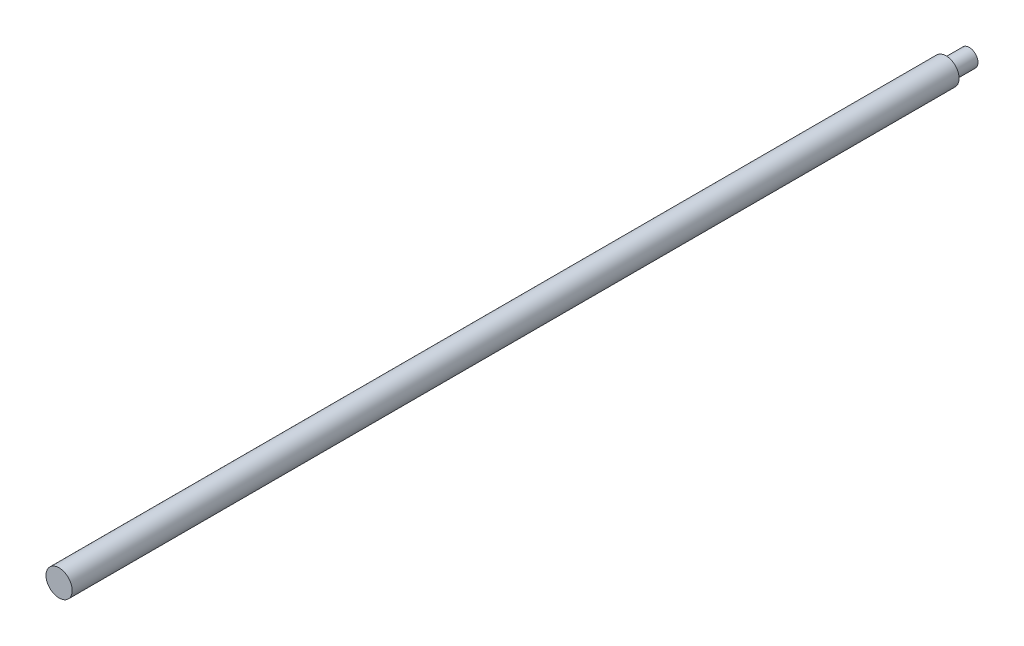
ISO-10303-21;
HEADER;
FILE_DESCRIPTION(('STEP AP214'),'2;1');
FILE_NAME('part.step','',(''),(''),'','','');
FILE_SCHEMA(('AUTOMOTIVE_DESIGN { 1 0 10303 214 1 1 1 1 }'));
ENDSEC;
DATA;
#1=APPLICATION_CONTEXT('core data for automotive mechanical design processes');
#2=APPLICATION_PROTOCOL_DEFINITION('international standard','automotive_design',2000,#1);
#3=PRODUCT_CONTEXT('',#1,'mechanical');
#4=PRODUCT('Part','Part','',(#3));
#5=PRODUCT_RELATED_PRODUCT_CATEGORY('part','',(#4));
#6=PRODUCT_DEFINITION_FORMATION('','',#4);
#7=PRODUCT_DEFINITION_CONTEXT('part definition',#1,'design');
#8=PRODUCT_DEFINITION('design','',#6,#7);
#9=PRODUCT_DEFINITION_SHAPE('','',#8);
#10=(LENGTH_UNIT() NAMED_UNIT(*) SI_UNIT(.MILLI.,.METRE.));
#11=(NAMED_UNIT(*) PLANE_ANGLE_UNIT() SI_UNIT($,.RADIAN.));
#12=(NAMED_UNIT(*) SI_UNIT($,.STERADIAN.) SOLID_ANGLE_UNIT());
#13=UNCERTAINTY_MEASURE_WITH_UNIT(LENGTH_MEASURE(1.E-05),#10,'distance_accuracy_value','');
#14=(GEOMETRIC_REPRESENTATION_CONTEXT(3) GLOBAL_UNCERTAINTY_ASSIGNED_CONTEXT((#13)) GLOBAL_UNIT_ASSIGNED_CONTEXT((#10,
#11,#12)) REPRESENTATION_CONTEXT('',''));
#15=CARTESIAN_POINT('',(0.,0.,0.));
#16=DIRECTION('',(0.,0.,1.));
#17=DIRECTION('',(1.,0.,0.));
#18=AXIS2_PLACEMENT_3D('',#15,#16,#17);
#19=CARTESIAN_POINT('',(0.,0.,-4.));
#20=DIRECTION('',(0.,0.,-1.));
#21=DIRECTION('',(-1.,0.,0.));
#22=AXIS2_PLACEMENT_3D('',#19,#20,#21);
#23=PLANE('',#22);
#24=CARTESIAN_POINT('',(0.,0.,-4.));
#25=DIRECTION('',(0.,0.,1.));
#26=DIRECTION('',(1.,0.,0.));
#27=AXIS2_PLACEMENT_3D('',#24,#25,#26);
#28=CIRCLE('',#27,1.5);
#29=CARTESIAN_POINT('',(1.5,0.,-4.));
#30=VERTEX_POINT('',#29);
#31=EDGE_CURVE('E18',#30,#30,#28,.T.);
#32=ORIENTED_EDGE('',*,*,#31,.F.);
#33=EDGE_LOOP('',(#32));
#34=FACE_BOUND('',#33,.T.);
#35=ADVANCED_FACE('F15',(#34),#23,.T.);
#36=CARTESIAN_POINT('',(0.,0.,-4.));
#37=DIRECTION('',(0.,0.,1.));
#38=DIRECTION('',(1.,0.,0.));
#39=AXIS2_PLACEMENT_3D('',#36,#37,#38);
#40=CYLINDRICAL_SURFACE('',#39,1.5);
#41=ORIENTED_EDGE('',*,*,#31,.T.);
#42=EDGE_LOOP('',(#41));
#43=FACE_BOUND('',#42,.T.);
#44=CARTESIAN_POINT('',(0.,0.,0.));
#45=DIRECTION('',(0.,0.,1.));
#46=DIRECTION('',(1.,0.,0.));
#47=AXIS2_PLACEMENT_3D('',#44,#45,#46);
#48=CIRCLE('',#47,1.5);
#49=CARTESIAN_POINT('',(1.5,0.,0.));
#50=VERTEX_POINT('',#49);
#51=EDGE_CURVE('E27',#50,#50,#48,.F.);
#52=ORIENTED_EDGE('',*,*,#51,.T.);
#53=EDGE_LOOP('',(#52));
#54=FACE_BOUND('',#53,.T.);
#55=ADVANCED_FACE('F35',(#43,#54),#40,.T.);
#56=CARTESIAN_POINT('',(0.,0.,152.4));
#57=DIRECTION('',(0.,0.,1.));
#58=DIRECTION('',(1.,0.,0.));
#59=AXIS2_PLACEMENT_3D('',#56,#57,#58);
#60=PLANE('',#59);
#61=CARTESIAN_POINT('',(0.,0.,152.4));
#62=DIRECTION('',(0.,0.,-1.));
#63=DIRECTION('',(-1.,0.,0.));
#64=AXIS2_PLACEMENT_3D('',#61,#62,#63);
#65=CIRCLE('',#64,2.25);
#66=CARTESIAN_POINT('',(-2.25,0.,152.4));
#67=VERTEX_POINT('',#66);
#68=EDGE_CURVE('E22',#67,#67,#65,.T.);
#69=ORIENTED_EDGE('',*,*,#68,.F.);
#70=EDGE_LOOP('',(#69));
#71=FACE_BOUND('',#70,.T.);
#72=ADVANCED_FACE('F42',(#71),#60,.T.);
#73=CARTESIAN_POINT('',(0.,0.,0.));
#74=DIRECTION('',(0.,0.,1.));
#75=DIRECTION('',(1.,0.,0.));
#76=AXIS2_PLACEMENT_3D('',#73,#74,#75);
#77=PLANE('',#76);
#78=ORIENTED_EDGE('',*,*,#51,.F.);
#79=EDGE_LOOP('',(#78));
#80=FACE_BOUND('',#79,.T.);
#81=CARTESIAN_POINT('',(0.,0.,0.));
#82=DIRECTION('',(0.,0.,-1.));
#83=DIRECTION('',(-1.,0.,0.));
#84=AXIS2_PLACEMENT_3D('',#81,#82,#83);
#85=CIRCLE('',#84,2.25);
#86=CARTESIAN_POINT('',(-2.25,0.,0.));
#87=VERTEX_POINT('',#86);
#88=EDGE_CURVE('E10',#87,#87,#85,.F.);
#89=ORIENTED_EDGE('',*,*,#88,.F.);
#90=EDGE_LOOP('',(#89));
#91=FACE_BOUND('',#90,.T.);
#92=ADVANCED_FACE('F45',(#80,#91),#77,.F.);
#93=CARTESIAN_POINT('',(0.,0.,152.4));
#94=DIRECTION('',(0.,0.,-1.));
#95=DIRECTION('',(-1.,0.,0.));
#96=AXIS2_PLACEMENT_3D('',#93,#94,#95);
#97=CYLINDRICAL_SURFACE('',#96,2.25);
#98=ORIENTED_EDGE('',*,*,#88,.T.);
#99=EDGE_LOOP('',(#98));
#100=FACE_BOUND('',#99,.T.);
#101=ORIENTED_EDGE('',*,*,#68,.T.);
#102=EDGE_LOOP('',(#101));
#103=FACE_BOUND('',#102,.T.);
#104=ADVANCED_FACE('F43',(#100,#103),#97,.T.);
#105=CLOSED_SHELL('',(#35,#55,#72,#92,#104));
#106=MANIFOLD_SOLID_BREP('B1',#105);
#107=ADVANCED_BREP_SHAPE_REPRESENTATION('',(#18,#106),#14);
#108=SHAPE_DEFINITION_REPRESENTATION(#9,#107);
ENDSEC;
END-ISO-10303-21;
